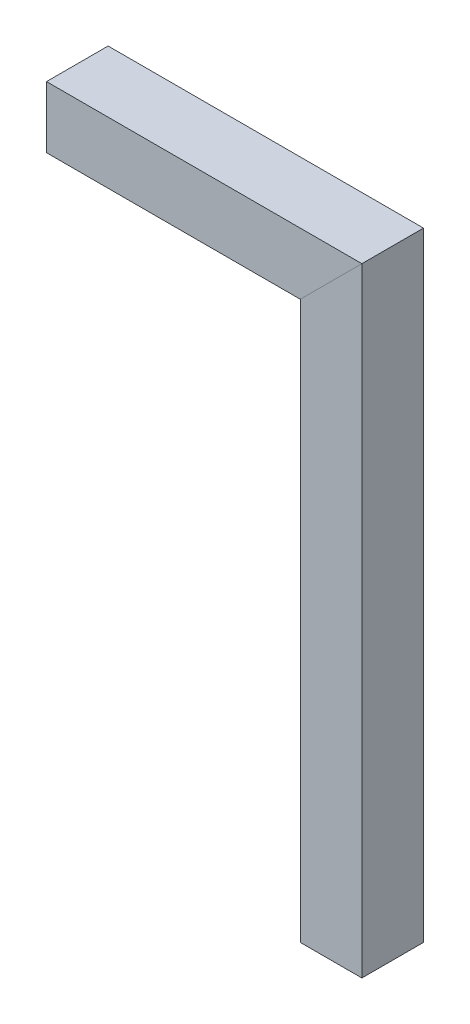
ISO-10303-21;
HEADER;
FILE_DESCRIPTION(('STEP AP214'),'2;1');
FILE_NAME('part.step','',(''),(''),'','','');
FILE_SCHEMA(('AUTOMOTIVE_DESIGN { 1 0 10303 214 1 1 1 1 }'));
ENDSEC;
DATA;
#1=APPLICATION_CONTEXT('core data for automotive mechanical design processes');
#2=APPLICATION_PROTOCOL_DEFINITION('international standard','automotive_design',2000,#1);
#3=PRODUCT_CONTEXT('',#1,'mechanical');
#4=PRODUCT('Part','Part','',(#3));
#5=PRODUCT_RELATED_PRODUCT_CATEGORY('part','',(#4));
#6=PRODUCT_DEFINITION_FORMATION('','',#4);
#7=PRODUCT_DEFINITION_CONTEXT('part definition',#1,'design');
#8=PRODUCT_DEFINITION('design','',#6,#7);
#9=PRODUCT_DEFINITION_SHAPE('','',#8);
#10=(LENGTH_UNIT() NAMED_UNIT(*) SI_UNIT(.MILLI.,.METRE.));
#11=(NAMED_UNIT(*) PLANE_ANGLE_UNIT() SI_UNIT($,.RADIAN.));
#12=(NAMED_UNIT(*) SI_UNIT($,.STERADIAN.) SOLID_ANGLE_UNIT());
#13=UNCERTAINTY_MEASURE_WITH_UNIT(LENGTH_MEASURE(1.E-05),#10,'distance_accuracy_value','');
#14=(GEOMETRIC_REPRESENTATION_CONTEXT(3) GLOBAL_UNCERTAINTY_ASSIGNED_CONTEXT((#13)) GLOBAL_UNIT_ASSIGNED_CONTEXT((#10,
#11,#12)) REPRESENTATION_CONTEXT('',''));
#15=CARTESIAN_POINT('',(0.,0.,0.));
#16=DIRECTION('',(0.,0.,1.));
#17=DIRECTION('',(1.,0.,0.));
#18=AXIS2_PLACEMENT_3D('',#15,#16,#17);
#19=CARTESIAN_POINT('',(-5.32101756039693E-13,0.,-50.8));
#20=DIRECTION('',(-1.,0.,0.));
#21=DIRECTION('',(0.,0.,1.));
#22=AXIS2_PLACEMENT_3D('',#19,#20,#21);
#23=PLANE('',#22);
#24=DIRECTION('',(0.,0.,-1.));
#25=VECTOR('',#24,1.);
#26=CARTESIAN_POINT('',(-5.32101756039693E-13,-5.32101756039693E-13,-50.8));
#27=LINE('',#26,#25);
#28=CARTESIAN_POINT('',(0.,0.,0.));
#29=VERTEX_POINT('',#28);
#30=CARTESIAN_POINT('',(-5.32101809170054E-13,-5.32101862300415E-13,-50.8));
#31=VERTEX_POINT('',#30);
#32=EDGE_CURVE('E185',#29,#31,#27,.T.);
#33=ORIENTED_EDGE('',*,*,#32,.F.);
#34=DIRECTION('',(0.,-1.,0.));
#35=VECTOR('',#34,1.);
#36=CARTESIAN_POINT('',(0.,0.,0.));
#37=LINE('',#36,#35);
#38=CARTESIAN_POINT('',(0.,-510.,0.));
#39=VERTEX_POINT('',#38);
#40=EDGE_CURVE('E81',#29,#39,#37,.T.);
#41=ORIENTED_EDGE('',*,*,#40,.T.);
#42=DIRECTION('',(0.,0.,-1.));
#43=VECTOR('',#42,1.);
#44=CARTESIAN_POINT('',(-4.69644769283178E-13,-510.,-50.8));
#45=LINE('',#44,#43);
#46=CARTESIAN_POINT('',(-4.69644769283178E-13,-510.,-50.8));
#47=VERTEX_POINT('',#46);
#48=EDGE_CURVE('E193',#39,#47,#45,.T.);
#49=ORIENTED_EDGE('',*,*,#48,.T.);
#50=DIRECTION('',(0.,-1.,0.));
#51=VECTOR('',#50,1.);
#52=CARTESIAN_POINT('',(-5.32101756039693E-13,0.,-50.8));
#53=LINE('',#52,#51);
#54=EDGE_CURVE('E136',#31,#47,#53,.T.);
#55=ORIENTED_EDGE('',*,*,#54,.F.);
#56=EDGE_LOOP('',(#33,#41,#49,#55));
#57=FACE_BOUND('',#56,.T.);
#58=ADVANCED_FACE('F77',(#57),#23,.F.);
#59=CARTESIAN_POINT('',(-0.0050800000005321,0.,-50.8));
#60=DIRECTION('',(0.,0.,1.));
#61=DIRECTION('',(1.,0.,0.));
#62=AXIS2_PLACEMENT_3D('',#59,#60,#61);
#63=PLANE('',#62);
#64=DIRECTION('',(-0.707106781186547,-0.707106781186548,0.));
#65=VECTOR('',#64,1.);
#66=CARTESIAN_POINT('',(-0.00254000000026605,-0.00254000000026605,-50.8));
#67=LINE('',#66,#65);
#68=CARTESIAN_POINT('',(-0.00508000000053171,-0.00508000000053171,-50.8));
#69=VERTEX_POINT('',#68);
#70=EDGE_CURVE('E143',#31,#69,#67,.T.);
#71=ORIENTED_EDGE('',*,*,#70,.F.);
#72=ORIENTED_EDGE('',*,*,#54,.T.);
#73=DIRECTION('',(-1.,0.,0.));
#74=VECTOR('',#73,1.);
#75=CARTESIAN_POINT('',(-0.00508000000046965,-510.,-50.8));
#76=LINE('',#75,#74);
#77=CARTESIAN_POINT('',(-0.00508000000046926,-510.,-50.8));
#78=VERTEX_POINT('',#77);
#79=EDGE_CURVE('E192',#47,#78,#76,.T.);
#80=ORIENTED_EDGE('',*,*,#79,.T.);
#81=DIRECTION('',(0.,-1.,0.));
#82=VECTOR('',#81,1.);
#83=CARTESIAN_POINT('',(-0.00508000000053171,0.,-50.8));
#84=LINE('',#83,#82);
#85=EDGE_CURVE('E194',#69,#78,#84,.T.);
#86=ORIENTED_EDGE('',*,*,#85,.F.);
#87=EDGE_LOOP('',(#71,#72,#80,#86));
#88=FACE_BOUND('',#87,.T.);
#89=ADVANCED_FACE('F228',(#88),#63,.F.);
#90=CARTESIAN_POINT('',(-0.00508000000049851,0.,-47.63008));
#91=DIRECTION('',(0.,-1.,0.));
#92=DIRECTION('',(1.,0.,0.));
#93=AXIS2_PLACEMENT_3D('',#90,#91,#92);
#94=CYLINDRICAL_SURFACE('',#93,3.16992);
#95=CARTESIAN_POINT('',(-0.00508000000049851,-0.00508000000049851,-47.63008));
#96=DIRECTION('',(-0.707106781186548,0.707106781186547,0.));
#97=DIRECTION('',(-0.707106781186547,-0.707106781186548,0.));
#98=AXIS2_PLACEMENT_3D('',#95,#96,#97);
#99=ELLIPSE('',#98,4.48294385563772,3.16992);
#100=CARTESIAN_POINT('',(-3.1750000000005,-3.17500000000029,-47.63008));
#101=VERTEX_POINT('',#100);
#102=EDGE_CURVE('E181',#69,#101,#99,.T.);
#103=ORIENTED_EDGE('',*,*,#102,.F.);
#104=ORIENTED_EDGE('',*,*,#85,.T.);
#105=CARTESIAN_POINT('',(-0.00508000000043606,-510.,-47.63008));
#106=DIRECTION('',(0.,1.,0.));
#107=DIRECTION('',(-1.,0.,0.));
#108=AXIS2_PLACEMENT_3D('',#105,#106,#107);
#109=CIRCLE('',#108,3.16992);
#110=CARTESIAN_POINT('',(-3.17500000000043,-510.,-47.63008));
#111=VERTEX_POINT('',#110);
#112=EDGE_CURVE('E196',#78,#111,#109,.T.);
#113=ORIENTED_EDGE('',*,*,#112,.T.);
#114=DIRECTION('',(0.,-1.,0.));
#115=VECTOR('',#114,1.);
#116=CARTESIAN_POINT('',(-3.1750000000005,0.,-47.63008));
#117=LINE('',#116,#115);
#118=EDGE_CURVE('E197',#101,#111,#117,.T.);
#119=ORIENTED_EDGE('',*,*,#118,.F.);
#120=EDGE_LOOP('',(#103,#104,#113,#119));
#121=FACE_BOUND('',#120,.T.);
#122=ADVANCED_FACE('F231',(#121),#94,.T.);
#123=CARTESIAN_POINT('',(-3.17500000000008,0.,-7.93749999999998));
#124=DIRECTION('',(1.,0.,0.));
#125=DIRECTION('',(0.,0.,-1.));
#126=AXIS2_PLACEMENT_3D('',#123,#124,#125);
#127=PLANE('',#126);
#128=DIRECTION('',(0.,0.,1.));
#129=VECTOR('',#128,1.);
#130=CARTESIAN_POINT('',(-3.17500000000007,-3.17500000000008,-7.93749999999995));
#131=LINE('',#130,#129);
#132=CARTESIAN_POINT('',(-3.17500000000008,-3.17500000000008,-7.93749999999998));
#133=VERTEX_POINT('',#132);
#134=EDGE_CURVE('E178',#101,#133,#131,.T.);
#135=ORIENTED_EDGE('',*,*,#134,.F.);
#136=ORIENTED_EDGE('',*,*,#118,.T.);
#137=DIRECTION('',(0.,0.,1.));
#138=VECTOR('',#137,1.);
#139=CARTESIAN_POINT('',(-3.17500000000001,-510.,-7.93749999999998));
#140=LINE('',#139,#138);
#141=CARTESIAN_POINT('',(-3.17500000000001,-510.,-7.93749999999998));
#142=VERTEX_POINT('',#141);
#143=EDGE_CURVE('E199',#111,#142,#140,.T.);
#144=ORIENTED_EDGE('',*,*,#143,.T.);
#145=DIRECTION('',(0.,-1.,0.));
#146=VECTOR('',#145,1.);
#147=CARTESIAN_POINT('',(-3.17500000000008,0.,-7.93749999999998));
#148=LINE('',#147,#146);
#149=EDGE_CURVE('E200',#133,#142,#148,.T.);
#150=ORIENTED_EDGE('',*,*,#149,.F.);
#151=EDGE_LOOP('',(#135,#136,#144,#150));
#152=FACE_BOUND('',#151,.T.);
#153=ADVANCED_FACE('F233',(#152),#127,.F.);
#154=CARTESIAN_POINT('',(-7.93750000000008,0.,-7.93749999999993));
#155=DIRECTION('',(0.,-1.,0.));
#156=DIRECTION('',(1.,0.,0.));
#157=AXIS2_PLACEMENT_3D('',#154,#155,#156);
#158=CYLINDRICAL_SURFACE('',#157,4.7625);
#159=CARTESIAN_POINT('',(-7.93750000000007,-7.93750000000008,-7.93749999999993));
#160=DIRECTION('',(-0.707106781186548,0.707106781186547,0.));
#161=DIRECTION('',(-0.707106781186547,-0.707106781186548,0.));
#162=AXIS2_PLACEMENT_3D('',#159,#160,#161);
#163=ELLIPSE('',#162,6.73519209080187,4.7625);
#164=CARTESIAN_POINT('',(-7.93750000000002,-7.93750000000002,-3.17499999999993));
#165=VERTEX_POINT('',#164);
#166=EDGE_CURVE('E173',#133,#165,#163,.F.);
#167=ORIENTED_EDGE('',*,*,#166,.F.);
#168=ORIENTED_EDGE('',*,*,#149,.T.);
#169=CARTESIAN_POINT('',(-7.93750000000001,-510.,-7.93749999999993));
#170=DIRECTION('',(0.,-1.,0.));
#171=DIRECTION('',(1.,0.,0.));
#172=AXIS2_PLACEMENT_3D('',#169,#170,#171);
#173=CIRCLE('',#172,4.7625);
#174=CARTESIAN_POINT('',(-7.93749999999996,-510.,-3.17499999999993));
#175=VERTEX_POINT('',#174);
#176=EDGE_CURVE('E202',#142,#175,#173,.T.);
#177=ORIENTED_EDGE('',*,*,#176,.T.);
#178=DIRECTION('',(0.,-1.,0.));
#179=VECTOR('',#178,1.);
#180=CARTESIAN_POINT('',(-7.93750000000003,0.,-3.17499999999993));
#181=LINE('',#180,#179);
#182=EDGE_CURVE('E203',#165,#175,#181,.T.);
#183=ORIENTED_EDGE('',*,*,#182,.F.);
#184=EDGE_LOOP('',(#167,#168,#177,#183));
#185=FACE_BOUND('',#184,.T.);
#186=ADVANCED_FACE('F237',(#185),#158,.F.);
#187=CARTESIAN_POINT('',(-47.63008,0.,-3.1749999999995));
#188=DIRECTION('',(0.,0.,1.));
#189=DIRECTION('',(1.,0.,0.));
#190=AXIS2_PLACEMENT_3D('',#187,#188,#189);
#191=PLANE('',#190);
#192=DIRECTION('',(-0.707106781186547,-0.707106781186548,0.));
#193=VECTOR('',#192,1.);
#194=CARTESIAN_POINT('',(-23.81504,-23.81504,-3.17499999999976));
#195=LINE('',#194,#193);
#196=CARTESIAN_POINT('',(-47.63008,-47.63008,-3.1749999999995));
#197=VERTEX_POINT('',#196);
#198=EDGE_CURVE('E171',#165,#197,#195,.T.);
#199=ORIENTED_EDGE('',*,*,#198,.F.);
#200=ORIENTED_EDGE('',*,*,#182,.T.);
#201=DIRECTION('',(-1.,0.,0.));
#202=VECTOR('',#201,1.);
#203=CARTESIAN_POINT('',(-47.63008,-510.,-3.1749999999995));
#204=LINE('',#203,#202);
#205=CARTESIAN_POINT('',(-47.63008,-510.,-3.1749999999995));
#206=VERTEX_POINT('',#205);
#207=EDGE_CURVE('E205',#175,#206,#204,.T.);
#208=ORIENTED_EDGE('',*,*,#207,.T.);
#209=DIRECTION('',(0.,-1.,0.));
#210=VECTOR('',#209,1.);
#211=CARTESIAN_POINT('',(-47.63008,0.,-3.1749999999995));
#212=LINE('',#211,#210);
#213=EDGE_CURVE('E206',#197,#206,#212,.T.);
#214=ORIENTED_EDGE('',*,*,#213,.F.);
#215=EDGE_LOOP('',(#199,#200,#208,#214));
#216=FACE_BOUND('',#215,.T.);
#217=ADVANCED_FACE('F241',(#216),#191,.F.);
#218=CARTESIAN_POINT('',(-47.63008,0.,-0.0050799999995013));
#219=DIRECTION('',(0.,-1.,0.));
#220=DIRECTION('',(1.,0.,0.));
#221=AXIS2_PLACEMENT_3D('',#218,#219,#220);
#222=CYLINDRICAL_SURFACE('',#221,3.16992);
#223=CARTESIAN_POINT('',(-47.63008,-47.63008,-0.0050799999995013));
#224=DIRECTION('',(-0.707106781186548,0.707106781186547,0.));
#225=DIRECTION('',(-0.707106781186547,-0.707106781186548,0.));
#226=AXIS2_PLACEMENT_3D('',#223,#224,#225);
#227=ELLIPSE('',#226,4.48294385563772,3.16992);
#228=CARTESIAN_POINT('',(-50.8,-50.8,-0.0050799999994679));
#229=VERTEX_POINT('',#228);
#230=EDGE_CURVE('E86',#197,#229,#227,.T.);
#231=ORIENTED_EDGE('',*,*,#230,.F.);
#232=ORIENTED_EDGE('',*,*,#213,.T.);
#233=CARTESIAN_POINT('',(-47.6300799999999,-510.,-0.0050799999995013));
#234=DIRECTION('',(0.,1.,0.));
#235=DIRECTION('',(1.,0.,0.));
#236=AXIS2_PLACEMENT_3D('',#233,#234,#235);
#237=CIRCLE('',#236,3.16992);
#238=CARTESIAN_POINT('',(-50.7999999999999,-510.,-0.0050799999994679));
#239=VERTEX_POINT('',#238);
#240=EDGE_CURVE('E165',#206,#239,#237,.T.);
#241=ORIENTED_EDGE('',*,*,#240,.T.);
#242=DIRECTION('',(0.,-1.,0.));
#243=VECTOR('',#242,1.);
#244=CARTESIAN_POINT('',(-50.8,0.,-0.0050799999994679));
#245=LINE('',#244,#243);
#246=EDGE_CURVE('E156',#229,#239,#245,.T.);
#247=ORIENTED_EDGE('',*,*,#246,.F.);
#248=EDGE_LOOP('',(#231,#232,#241,#247));
#249=FACE_BOUND('',#248,.T.);
#250=ADVANCED_FACE('F162',(#249),#222,.T.);
#251=CARTESIAN_POINT('',(-50.8,0.,5.32101756039693E-13));
#252=DIRECTION('',(1.,0.,0.));
#253=DIRECTION('',(0.,1.,0.));
#254=AXIS2_PLACEMENT_3D('',#251,#252,#253);
#255=PLANE('',#254);
#256=DIRECTION('',(0.,0.,1.));
#257=VECTOR('',#256,1.);
#258=CARTESIAN_POINT('',(-50.8,-50.8,5.32101756039693E-13));
#259=LINE('',#258,#257);
#260=CARTESIAN_POINT('',(-50.8,-50.8,5.32101756039693E-13));
#261=VERTEX_POINT('',#260);
#262=EDGE_CURVE('E14',#229,#261,#259,.T.);
#263=ORIENTED_EDGE('',*,*,#262,.F.);
#264=ORIENTED_EDGE('',*,*,#246,.T.);
#265=DIRECTION('',(0.,0.,1.));
#266=VECTOR('',#265,1.);
#267=CARTESIAN_POINT('',(-50.7999999999999,-510.,5.32101756039693E-13));
#268=LINE('',#267,#266);
#269=CARTESIAN_POINT('',(-50.7999999999999,-510.,5.32101756039693E-13));
#270=VERTEX_POINT('',#269);
#271=EDGE_CURVE('E167',#239,#270,#268,.T.);
#272=ORIENTED_EDGE('',*,*,#271,.T.);
#273=DIRECTION('',(0.,-1.,0.));
#274=VECTOR('',#273,1.);
#275=CARTESIAN_POINT('',(-50.8,0.,5.32101756039693E-13));
#276=LINE('',#275,#274);
#277=EDGE_CURVE('E99',#261,#270,#276,.T.);
#278=ORIENTED_EDGE('',*,*,#277,.F.);
#279=EDGE_LOOP('',(#263,#264,#272,#278));
#280=FACE_BOUND('',#279,.T.);
#281=ADVANCED_FACE('F155',(#280),#255,.F.);
#282=CARTESIAN_POINT('',(0.,0.,0.));
#283=DIRECTION('',(0.,0.,-1.));
#284=DIRECTION('',(-1.,0.,0.));
#285=AXIS2_PLACEMENT_3D('',#282,#283,#284);
#286=PLANE('',#285);
#287=DIRECTION('',(0.707106781186547,0.707106781186548,0.));
#288=VECTOR('',#287,1.);
#289=CARTESIAN_POINT('',(0.,0.,0.));
#290=LINE('',#289,#288);
#291=EDGE_CURVE('E188',#261,#29,#290,.T.);
#292=ORIENTED_EDGE('',*,*,#291,.F.);
#293=ORIENTED_EDGE('',*,*,#277,.T.);
#294=DIRECTION('',(1.,0.,0.));
#295=VECTOR('',#294,1.);
#296=CARTESIAN_POINT('',(0.,-510.,0.));
#297=LINE('',#296,#295);
#298=EDGE_CURVE('E190',#270,#39,#297,.T.);
#299=ORIENTED_EDGE('',*,*,#298,.T.);
#300=ORIENTED_EDGE('',*,*,#40,.F.);
#301=EDGE_LOOP('',(#292,#293,#299,#300));
#302=FACE_BOUND('',#301,.T.);
#303=ADVANCED_FACE('F223',(#302),#286,.F.);
#304=CARTESIAN_POINT('',(-47.6300799999999,-510.,-0.0050799999995013));
#305=DIRECTION('',(0.,-1.,0.));
#306=DIRECTION('',(1.,0.,0.));
#307=AXIS2_PLACEMENT_3D('',#304,#305,#306);
#308=PLANE('',#307);
#309=ORIENTED_EDGE('',*,*,#48,.F.);
#310=ORIENTED_EDGE('',*,*,#298,.F.);
#311=ORIENTED_EDGE('',*,*,#271,.F.);
#312=ORIENTED_EDGE('',*,*,#240,.F.);
#313=ORIENTED_EDGE('',*,*,#207,.F.);
#314=ORIENTED_EDGE('',*,*,#176,.F.);
#315=ORIENTED_EDGE('',*,*,#143,.F.);
#316=ORIENTED_EDGE('',*,*,#112,.F.);
#317=ORIENTED_EDGE('',*,*,#79,.F.);
#318=EDGE_LOOP('',(#309,#310,#311,#312,#313,#314,#315,#316,#317));
#319=FACE_BOUND('',#318,.T.);
#320=ADVANCED_FACE('F225',(#319),#308,.T.);
#321=CARTESIAN_POINT('',(0.,0.,0.));
#322=DIRECTION('',(-0.707106781186548,0.707106781186547,0.));
#323=DIRECTION('',(-0.707106781186547,-0.707106781186548,0.));
#324=AXIS2_PLACEMENT_3D('',#321,#322,#323);
#325=PLANE('',#324);
#326=ORIENTED_EDGE('',*,*,#291,.T.);
#327=ORIENTED_EDGE('',*,*,#32,.T.);
#328=ORIENTED_EDGE('',*,*,#70,.T.);
#329=ORIENTED_EDGE('',*,*,#102,.T.);
#330=ORIENTED_EDGE('',*,*,#134,.T.);
#331=ORIENTED_EDGE('',*,*,#166,.T.);
#332=ORIENTED_EDGE('',*,*,#198,.T.);
#333=ORIENTED_EDGE('',*,*,#230,.T.);
#334=ORIENTED_EDGE('',*,*,#262,.T.);
#335=EDGE_LOOP('',(#326,#327,#328,#329,#330,#331,#332,#333,#334));
#336=FACE_BOUND('',#335,.T.);
#337=ADVANCED_FACE('F79',(#336),#325,.T.);
#338=CLOSED_SHELL('',(#58,#89,#122,#153,#186,#217,#250,#281,#303,#320,#337));
#339=MANIFOLD_SOLID_BREP('B2',#338);
#340=CARTESIAN_POINT('',(-260.,-5.63942572817525E-13,-50.8));
#341=DIRECTION('',(0.,-1.,0.));
#342=DIRECTION('',(0.,0.,-1.));
#343=AXIS2_PLACEMENT_3D('',#340,#341,#342);
#344=PLANE('',#343);
#345=DIRECTION('',(0.,0.,1.));
#346=VECTOR('',#345,1.);
#347=CARTESIAN_POINT('',(-4.9960036108132E-13,-5.32101756039722E-13,-50.8000000000027));
#348=LINE('',#347,#346);
#349=CARTESIAN_POINT('',(-4.9960036108132E-13,-5.29728846368322E-13,-50.8));
#350=VERTEX_POINT('',#349);
#351=CARTESIAN_POINT('',(0.,0.,0.));
#352=VERTEX_POINT('',#351);
#353=EDGE_CURVE('E470',#350,#352,#348,.T.);
#354=ORIENTED_EDGE('',*,*,#353,.F.);
#355=DIRECTION('',(1.,0.,0.));
#356=VECTOR('',#355,1.);
#357=CARTESIAN_POINT('',(-260.,-5.63942572817525E-13,-50.8));
#358=LINE('',#357,#356);
#359=CARTESIAN_POINT('',(-260.,-5.63942572817525E-13,-50.8));
#360=VERTEX_POINT('',#359);
#361=EDGE_CURVE('E475',#360,#350,#358,.T.);
#362=ORIENTED_EDGE('',*,*,#361,.F.);
#363=DIRECTION('',(0.,0.,-1.));
#364=VECTOR('',#363,1.);
#365=CARTESIAN_POINT('',(-260.,-5.63942572817525E-13,-50.8));
#366=LINE('',#365,#364);
#367=CARTESIAN_POINT('',(-260.,0.,0.));
#368=VERTEX_POINT('',#367);
#369=EDGE_CURVE('E462',#368,#360,#366,.T.);
#370=ORIENTED_EDGE('',*,*,#369,.F.);
#371=DIRECTION('',(1.,0.,0.));
#372=VECTOR('',#371,1.);
#373=CARTESIAN_POINT('',(-260.,0.,0.));
#374=LINE('',#373,#372);
#375=EDGE_CURVE('E371',#368,#352,#374,.T.);
#376=ORIENTED_EDGE('',*,*,#375,.T.);
#377=EDGE_LOOP('',(#354,#362,#370,#376));
#378=FACE_BOUND('',#377,.T.);
#379=ADVANCED_FACE('F367',(#378),#344,.F.);
#380=CARTESIAN_POINT('',(-260.,-0.00508000000056394,-50.8));
#381=DIRECTION('',(0.,0.,1.));
#382=DIRECTION('',(1.,0.,0.));
#383=AXIS2_PLACEMENT_3D('',#380,#381,#382);
#384=PLANE('',#383);
#385=DIRECTION('',(0.707106781186547,0.707106781186548,0.));
#386=VECTOR('',#385,1.);
#387=CARTESIAN_POINT('',(-130.00254,-130.00254,-50.8));
#388=LINE('',#387,#386);
#389=CARTESIAN_POINT('',(-0.00508000000054576,-0.00508000000053172,-50.8));
#390=VERTEX_POINT('',#389);
#391=EDGE_CURVE('E425',#390,#350,#388,.T.);
#392=ORIENTED_EDGE('',*,*,#391,.F.);
#393=DIRECTION('',(1.,0.,0.));
#394=VECTOR('',#393,1.);
#395=CARTESIAN_POINT('',(-260.,-0.00508000000056356,-50.8));
#396=LINE('',#395,#394);
#397=CARTESIAN_POINT('',(-260.,-0.00508000000056356,-50.8));
#398=VERTEX_POINT('',#397);
#399=EDGE_CURVE('E477',#398,#390,#396,.T.);
#400=ORIENTED_EDGE('',*,*,#399,.F.);
#401=DIRECTION('',(0.,-1.,0.));
#402=VECTOR('',#401,1.);
#403=CARTESIAN_POINT('',(-260.,-0.00508000000056394,-50.8));
#404=LINE('',#403,#402);
#405=EDGE_CURVE('E417',#360,#398,#404,.T.);
#406=ORIENTED_EDGE('',*,*,#405,.F.);
#407=ORIENTED_EDGE('',*,*,#361,.T.);
#408=EDGE_LOOP('',(#392,#400,#406,#407));
#409=FACE_BOUND('',#408,.T.);
#410=ADVANCED_FACE('F528',(#409),#384,.F.);
#411=CARTESIAN_POINT('',(-260.,-0.00508000000053035,-47.63008));
#412=DIRECTION('',(1.,0.,0.));
#413=DIRECTION('',(0.,1.,0.));
#414=AXIS2_PLACEMENT_3D('',#411,#412,#413);
#415=CYLINDRICAL_SURFACE('',#414,3.16992);
#416=CARTESIAN_POINT('',(-0.00508000000049025,-0.00508000000049851,-47.63008));
#417=DIRECTION('',(0.707106781186548,-0.707106781186547,0.));
#418=DIRECTION('',(0.707106781186547,0.707106781186548,0.));
#419=AXIS2_PLACEMENT_3D('',#416,#417,#418);
#420=ELLIPSE('',#419,4.48294385563772,3.16992);
#421=CARTESIAN_POINT('',(-3.17500000000032,-3.1750000000005,-47.63008));
#422=VERTEX_POINT('',#421);
#423=EDGE_CURVE('E75',#422,#390,#420,.T.);
#424=ORIENTED_EDGE('',*,*,#423,.F.);
#425=DIRECTION('',(1.,0.,0.));
#426=VECTOR('',#425,1.);
#427=CARTESIAN_POINT('',(-260.,-3.17500000000053,-47.63008));
#428=LINE('',#427,#426);
#429=CARTESIAN_POINT('',(-260.,-3.17500000000053,-47.63008));
#430=VERTEX_POINT('',#429);
#431=EDGE_CURVE('E479',#430,#422,#428,.T.);
#432=ORIENTED_EDGE('',*,*,#431,.F.);
#433=CARTESIAN_POINT('',(-260.,-0.00508000000053035,-47.63008));
#434=DIRECTION('',(-1.,0.,0.));
#435=DIRECTION('',(0.,-1.,0.));
#436=AXIS2_PLACEMENT_3D('',#433,#434,#435);
#437=CIRCLE('',#436,3.16992);
#438=EDGE_CURVE('E503',#398,#430,#437,.T.);
#439=ORIENTED_EDGE('',*,*,#438,.F.);
#440=ORIENTED_EDGE('',*,*,#399,.T.);
#441=EDGE_LOOP('',(#424,#432,#439,#440));
#442=FACE_BOUND('',#441,.T.);
#443=ADVANCED_FACE('F527',(#442),#415,.T.);
#444=CARTESIAN_POINT('',(-260.,-3.17500000000011,-7.93749999999998));
#445=DIRECTION('',(0.,1.,0.));
#446=DIRECTION('',(0.,0.,1.));
#447=AXIS2_PLACEMENT_3D('',#444,#445,#446);
#448=PLANE('',#447);
#449=DIRECTION('',(0.,0.,-1.));
#450=VECTOR('',#449,1.);
#451=CARTESIAN_POINT('',(-3.17500000000009,-3.17500000000008,-7.93750000000271));
#452=LINE('',#451,#450);
#453=CARTESIAN_POINT('',(-3.17500000000009,-3.17500000000008,-7.93749999999998));
#454=VERTEX_POINT('',#453);
#455=EDGE_CURVE('E377',#454,#422,#452,.T.);
#456=ORIENTED_EDGE('',*,*,#455,.F.);
#457=DIRECTION('',(1.,0.,0.));
#458=VECTOR('',#457,1.);
#459=CARTESIAN_POINT('',(-260.,-3.17500000000011,-7.93749999999998));
#460=LINE('',#459,#458);
#461=CARTESIAN_POINT('',(-260.,-3.17500000000011,-7.93749999999998));
#462=VERTEX_POINT('',#461);
#463=EDGE_CURVE('E482',#462,#454,#460,.T.);
#464=ORIENTED_EDGE('',*,*,#463,.F.);
#465=DIRECTION('',(0.,0.,1.));
#466=VECTOR('',#465,1.);
#467=CARTESIAN_POINT('',(-260.,-3.17500000000011,-7.93749999999998));
#468=LINE('',#467,#466);
#469=EDGE_CURVE('E505',#430,#462,#468,.T.);
#470=ORIENTED_EDGE('',*,*,#469,.F.);
#471=ORIENTED_EDGE('',*,*,#431,.T.);
#472=EDGE_LOOP('',(#456,#464,#470,#471));
#473=FACE_BOUND('',#472,.T.);
#474=ADVANCED_FACE('F522',(#473),#448,.F.);
#475=CARTESIAN_POINT('',(-260.,-7.93750000000011,-7.93749999999993));
#476=DIRECTION('',(1.,0.,0.));
#477=DIRECTION('',(0.,1.,0.));
#478=AXIS2_PLACEMENT_3D('',#475,#476,#477);
#479=CYLINDRICAL_SURFACE('',#478,4.7625);
#480=CARTESIAN_POINT('',(-7.9375000000001,-7.93750000000008,-7.93749999999993));
#481=DIRECTION('',(0.707106781186548,-0.707106781186547,0.));
#482=DIRECTION('',(0.707106781186547,0.707106781186548,0.));
#483=AXIS2_PLACEMENT_3D('',#480,#481,#482);
#484=ELLIPSE('',#483,6.73519209080187,4.7625);
#485=CARTESIAN_POINT('',(-7.93750000000004,-7.93750000000002,-3.17499999999993));
#486=VERTEX_POINT('',#485);
#487=EDGE_CURVE('E494',#486,#454,#484,.F.);
#488=ORIENTED_EDGE('',*,*,#487,.F.);
#489=DIRECTION('',(1.,0.,0.));
#490=VECTOR('',#489,1.);
#491=CARTESIAN_POINT('',(-260.,-7.93750000000006,-3.17499999999993));
#492=LINE('',#491,#490);
#493=CARTESIAN_POINT('',(-260.,-7.93750000000006,-3.17499999999993));
#494=VERTEX_POINT('',#493);
#495=EDGE_CURVE('E485',#494,#486,#492,.T.);
#496=ORIENTED_EDGE('',*,*,#495,.F.);
#497=CARTESIAN_POINT('',(-260.,-7.93750000000011,-7.93749999999993));
#498=DIRECTION('',(1.,0.,0.));
#499=DIRECTION('',(0.,1.,0.));
#500=AXIS2_PLACEMENT_3D('',#497,#498,#499);
#501=CIRCLE('',#500,4.7625);
#502=EDGE_CURVE('E507',#462,#494,#501,.T.);
#503=ORIENTED_EDGE('',*,*,#502,.F.);
#504=ORIENTED_EDGE('',*,*,#463,.T.);
#505=EDGE_LOOP('',(#488,#496,#503,#504));
#506=FACE_BOUND('',#505,.T.);
#507=ADVANCED_FACE('F519',(#506),#479,.F.);
#508=CARTESIAN_POINT('',(-260.,-47.6300800000001,-3.1749999999995));
#509=DIRECTION('',(0.,0.,1.));
#510=DIRECTION('',(0.,-1.,0.));
#511=AXIS2_PLACEMENT_3D('',#508,#509,#510);
#512=PLANE('',#511);
#513=DIRECTION('',(0.707106781186547,0.707106781186548,0.));
#514=VECTOR('',#513,1.);
#515=CARTESIAN_POINT('',(-153.81504,-153.81504,-3.17499999999834));
#516=LINE('',#515,#514);
#517=CARTESIAN_POINT('',(-47.63008,-47.63008,-3.1749999999995));
#518=VERTEX_POINT('',#517);
#519=EDGE_CURVE('E442',#518,#486,#516,.T.);
#520=ORIENTED_EDGE('',*,*,#519,.F.);
#521=DIRECTION('',(1.,0.,0.));
#522=VECTOR('',#521,1.);
#523=CARTESIAN_POINT('',(-260.,-47.6300800000001,-3.1749999999995));
#524=LINE('',#523,#522);
#525=CARTESIAN_POINT('',(-260.,-47.6300800000001,-3.1749999999995));
#526=VERTEX_POINT('',#525);
#527=EDGE_CURVE('E487',#526,#518,#524,.T.);
#528=ORIENTED_EDGE('',*,*,#527,.F.);
#529=DIRECTION('',(0.,-1.,0.));
#530=VECTOR('',#529,1.);
#531=CARTESIAN_POINT('',(-260.,-47.6300800000001,-3.1749999999995));
#532=LINE('',#531,#530);
#533=EDGE_CURVE('E509',#494,#526,#532,.T.);
#534=ORIENTED_EDGE('',*,*,#533,.F.);
#535=ORIENTED_EDGE('',*,*,#495,.T.);
#536=EDGE_LOOP('',(#520,#528,#534,#535));
#537=FACE_BOUND('',#536,.T.);
#538=ADVANCED_FACE('F517',(#537),#512,.F.);
#539=CARTESIAN_POINT('',(-260.,-47.63008,-0.0050799999995013));
#540=DIRECTION('',(1.,0.,0.));
#541=DIRECTION('',(0.,1.,0.));
#542=AXIS2_PLACEMENT_3D('',#539,#540,#541);
#543=CYLINDRICAL_SURFACE('',#542,3.16992);
#544=CARTESIAN_POINT('',(-47.63008,-47.63008,-0.0050799999995013));
#545=DIRECTION('',(0.707106781186548,-0.707106781186547,0.));
#546=DIRECTION('',(0.707106781186547,0.707106781186548,0.));
#547=AXIS2_PLACEMENT_3D('',#544,#545,#546);
#548=ELLIPSE('',#547,4.48294385563772,3.16992);
#549=CARTESIAN_POINT('',(-50.8,-50.8,-0.0050799999994679));
#550=VERTEX_POINT('',#549);
#551=EDGE_CURVE('E448',#550,#518,#548,.T.);
#552=ORIENTED_EDGE('',*,*,#551,.F.);
#553=DIRECTION('',(1.,0.,0.));
#554=VECTOR('',#553,1.);
#555=CARTESIAN_POINT('',(-260.,-50.8,-0.0050799999994679));
#556=LINE('',#555,#554);
#557=CARTESIAN_POINT('',(-260.,-50.8,-0.0050799999994679));
#558=VERTEX_POINT('',#557);
#559=EDGE_CURVE('E463',#558,#550,#556,.T.);
#560=ORIENTED_EDGE('',*,*,#559,.F.);
#561=CARTESIAN_POINT('',(-260.,-47.63008,-0.0050799999995013));
#562=DIRECTION('',(-1.,0.,0.));
#563=DIRECTION('',(0.,1.,0.));
#564=AXIS2_PLACEMENT_3D('',#561,#562,#563);
#565=CIRCLE('',#564,3.16992);
#566=EDGE_CURVE('E491',#526,#558,#565,.T.);
#567=ORIENTED_EDGE('',*,*,#566,.F.);
#568=ORIENTED_EDGE('',*,*,#527,.T.);
#569=EDGE_LOOP('',(#552,#560,#567,#568));
#570=FACE_BOUND('',#569,.T.);
#571=ADVANCED_FACE('F490',(#570),#543,.T.);
#572=CARTESIAN_POINT('',(-260.,-50.8,5.32101756039693E-13));
#573=DIRECTION('',(0.,1.,0.));
#574=DIRECTION('',(-1.,0.,0.));
#575=AXIS2_PLACEMENT_3D('',#572,#573,#574);
#576=PLANE('',#575);
#577=DIRECTION('',(0.,0.,-1.));
#578=VECTOR('',#577,1.);
#579=CARTESIAN_POINT('',(-50.8,-50.8,5.32101756039693E-13));
#580=LINE('',#579,#578);
#581=CARTESIAN_POINT('',(-50.8000000000001,-50.8,5.32101756039694E-13));
#582=VERTEX_POINT('',#581);
#583=EDGE_CURVE('E465',#582,#550,#580,.T.);
#584=ORIENTED_EDGE('',*,*,#583,.F.);
#585=DIRECTION('',(1.,0.,0.));
#586=VECTOR('',#585,1.);
#587=CARTESIAN_POINT('',(-260.,-50.8,5.32101756039693E-13));
#588=LINE('',#587,#586);
#589=CARTESIAN_POINT('',(-260.,-50.8,5.32101756039693E-13));
#590=VERTEX_POINT('',#589);
#591=EDGE_CURVE('E454',#590,#582,#588,.T.);
#592=ORIENTED_EDGE('',*,*,#591,.F.);
#593=DIRECTION('',(0.,0.,1.));
#594=VECTOR('',#593,1.);
#595=CARTESIAN_POINT('',(-260.,-50.8,5.32101756039693E-13));
#596=LINE('',#595,#594);
#597=EDGE_CURVE('E512',#558,#590,#596,.T.);
#598=ORIENTED_EDGE('',*,*,#597,.F.);
#599=ORIENTED_EDGE('',*,*,#559,.T.);
#600=EDGE_LOOP('',(#584,#592,#598,#599));
#601=FACE_BOUND('',#600,.T.);
#602=ADVANCED_FACE('F466',(#601),#576,.F.);
#603=CARTESIAN_POINT('',(-260.,0.,0.));
#604=DIRECTION('',(0.,0.,-1.));
#605=DIRECTION('',(0.,1.,0.));
#606=AXIS2_PLACEMENT_3D('',#603,#604,#605);
#607=PLANE('',#606);
#608=DIRECTION('',(-0.707106781186547,-0.707106781186548,0.));
#609=VECTOR('',#608,1.);
#610=CARTESIAN_POINT('',(-130.,-130.,1.36167772214882E-12));
#611=LINE('',#610,#609);
#612=EDGE_CURVE('E458',#352,#582,#611,.T.);
#613=ORIENTED_EDGE('',*,*,#612,.F.);
#614=ORIENTED_EDGE('',*,*,#375,.F.);
#615=DIRECTION('',(0.,1.,0.));
#616=VECTOR('',#615,1.);
#617=CARTESIAN_POINT('',(-260.,0.,0.));
#618=LINE('',#617,#616);
#619=EDGE_CURVE('E386',#590,#368,#618,.T.);
#620=ORIENTED_EDGE('',*,*,#619,.F.);
#621=ORIENTED_EDGE('',*,*,#591,.T.);
#622=EDGE_LOOP('',(#613,#614,#620,#621));
#623=FACE_BOUND('',#622,.T.);
#624=ADVANCED_FACE('F456',(#623),#607,.F.);
#625=CARTESIAN_POINT('',(-260.,-47.63008,-0.0050799999995013));
#626=DIRECTION('',(1.,0.,0.));
#627=DIRECTION('',(0.,1.,0.));
#628=AXIS2_PLACEMENT_3D('',#625,#626,#627);
#629=PLANE('',#628);
#630=ORIENTED_EDGE('',*,*,#369,.T.);
#631=ORIENTED_EDGE('',*,*,#405,.T.);
#632=ORIENTED_EDGE('',*,*,#438,.T.);
#633=ORIENTED_EDGE('',*,*,#469,.T.);
#634=ORIENTED_EDGE('',*,*,#502,.T.);
#635=ORIENTED_EDGE('',*,*,#533,.T.);
#636=ORIENTED_EDGE('',*,*,#566,.T.);
#637=ORIENTED_EDGE('',*,*,#597,.T.);
#638=ORIENTED_EDGE('',*,*,#619,.T.);
#639=EDGE_LOOP('',(#630,#631,#632,#633,#634,#635,#636,#637,#638));
#640=FACE_BOUND('',#639,.T.);
#641=ADVANCED_FACE('F514',(#640),#629,.F.);
#642=CARTESIAN_POINT('',(0.,0.,0.));
#643=DIRECTION('',(0.707106781186548,-0.707106781186547,0.));
#644=DIRECTION('',(0.707106781186547,0.707106781186548,0.));
#645=AXIS2_PLACEMENT_3D('',#642,#643,#644);
#646=PLANE('',#645);
#647=ORIENTED_EDGE('',*,*,#391,.T.);
#648=ORIENTED_EDGE('',*,*,#353,.T.);
#649=ORIENTED_EDGE('',*,*,#612,.T.);
#650=ORIENTED_EDGE('',*,*,#583,.T.);
#651=ORIENTED_EDGE('',*,*,#551,.T.);
#652=ORIENTED_EDGE('',*,*,#519,.T.);
#653=ORIENTED_EDGE('',*,*,#487,.T.);
#654=ORIENTED_EDGE('',*,*,#455,.T.);
#655=ORIENTED_EDGE('',*,*,#423,.T.);
#656=EDGE_LOOP('',(#647,#648,#649,#650,#651,#652,#653,#654,#655));
#657=FACE_BOUND('',#656,.T.);
#658=ADVANCED_FACE('F369',(#657),#646,.T.);
#659=CLOSED_SHELL('',(#379,#410,#443,#474,#507,#538,#571,#602,#624,#641,#658));
#660=MANIFOLD_SOLID_BREP('B8',#659);
#661=ADVANCED_BREP_SHAPE_REPRESENTATION('',(#18,#339,#660),#14);
#662=SHAPE_DEFINITION_REPRESENTATION(#9,#661);
ENDSEC;
END-ISO-10303-21;
